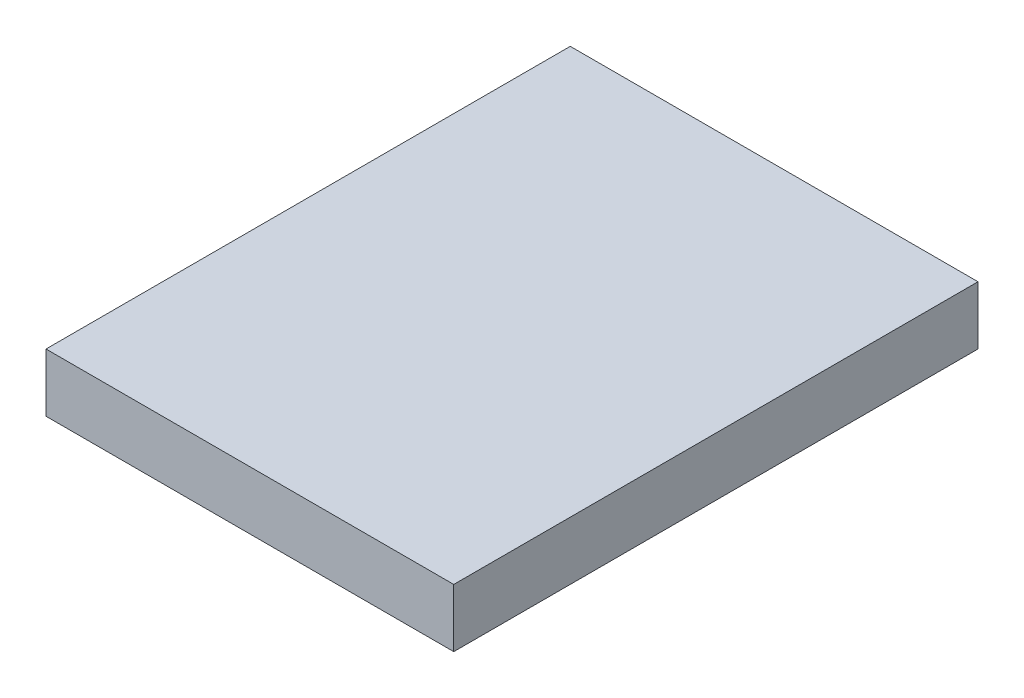
ISO-10303-21;
HEADER;
FILE_DESCRIPTION(('STEP AP214'),'2;1');
FILE_NAME('part.step','',(''),(''),'','','');
FILE_SCHEMA(('AUTOMOTIVE_DESIGN { 1 0 10303 214 1 1 1 1 }'));
ENDSEC;
DATA;
#1=APPLICATION_CONTEXT('core data for automotive mechanical design processes');
#2=APPLICATION_PROTOCOL_DEFINITION('international standard','automotive_design',2000,#1);
#3=PRODUCT_CONTEXT('',#1,'mechanical');
#4=PRODUCT('Part','Part','',(#3));
#5=PRODUCT_RELATED_PRODUCT_CATEGORY('part','',(#4));
#6=PRODUCT_DEFINITION_FORMATION('','',#4);
#7=PRODUCT_DEFINITION_CONTEXT('part definition',#1,'design');
#8=PRODUCT_DEFINITION('design','',#6,#7);
#9=PRODUCT_DEFINITION_SHAPE('','',#8);
#10=(LENGTH_UNIT() NAMED_UNIT(*) SI_UNIT(.MILLI.,.METRE.));
#11=(NAMED_UNIT(*) PLANE_ANGLE_UNIT() SI_UNIT($,.RADIAN.));
#12=(NAMED_UNIT(*) SI_UNIT($,.STERADIAN.) SOLID_ANGLE_UNIT());
#13=UNCERTAINTY_MEASURE_WITH_UNIT(LENGTH_MEASURE(1.E-05),#10,'distance_accuracy_value','');
#14=(GEOMETRIC_REPRESENTATION_CONTEXT(3) GLOBAL_UNCERTAINTY_ASSIGNED_CONTEXT((#13)) GLOBAL_UNIT_ASSIGNED_CONTEXT((#10,
#11,#12)) REPRESENTATION_CONTEXT('',''));
#15=CARTESIAN_POINT('',(0.,0.,0.));
#16=DIRECTION('',(0.,0.,1.));
#17=DIRECTION('',(1.,0.,0.));
#18=AXIS2_PLACEMENT_3D('',#15,#16,#17);
#19=CARTESIAN_POINT('',(88.9,-12.7,228.6));
#20=DIRECTION('',(-1.,0.,0.));
#21=DIRECTION('',(0.,0.,1.));
#22=AXIS2_PLACEMENT_3D('',#19,#20,#21);
#23=PLANE('',#22);
#24=DIRECTION('',(0.,1.,0.));
#25=VECTOR('',#24,1.);
#26=CARTESIAN_POINT('',(88.9,-12.7,0.));
#27=LINE('',#26,#25);
#28=CARTESIAN_POINT('',(88.9,-12.7,0.));
#29=VERTEX_POINT('',#28);
#30=CARTESIAN_POINT('',(88.9,12.7,0.));
#31=VERTEX_POINT('',#30);
#32=EDGE_CURVE('E104',#29,#31,#27,.T.);
#33=ORIENTED_EDGE('',*,*,#32,.T.);
#34=DIRECTION('',(0.,0.,-1.));
#35=VECTOR('',#34,1.);
#36=CARTESIAN_POINT('',(88.9,12.7,228.6));
#37=LINE('',#36,#35);
#38=CARTESIAN_POINT('',(88.9,12.7,228.6));
#39=VERTEX_POINT('',#38);
#40=EDGE_CURVE('E11',#39,#31,#37,.T.);
#41=ORIENTED_EDGE('',*,*,#40,.F.);
#42=DIRECTION('',(0.,1.,0.));
#43=VECTOR('',#42,1.);
#44=CARTESIAN_POINT('',(88.9,-12.7,228.6));
#45=LINE('',#44,#43);
#46=CARTESIAN_POINT('',(88.9,-12.7,228.6));
#47=VERTEX_POINT('',#46);
#48=EDGE_CURVE('E92',#47,#39,#45,.T.);
#49=ORIENTED_EDGE('',*,*,#48,.F.);
#50=DIRECTION('',(0.,0.,-1.));
#51=VECTOR('',#50,1.);
#52=CARTESIAN_POINT('',(88.9,-12.7,228.6));
#53=LINE('',#52,#51);
#54=EDGE_CURVE('E100',#47,#29,#53,.T.);
#55=ORIENTED_EDGE('',*,*,#54,.T.);
#56=EDGE_LOOP('',(#33,#41,#49,#55));
#57=FACE_BOUND('',#56,.T.);
#58=ADVANCED_FACE('F41',(#57),#23,.F.);
#59=CARTESIAN_POINT('',(-88.9,12.7,228.6));
#60=DIRECTION('',(0.,-1.,0.));
#61=DIRECTION('',(0.,0.,-1.));
#62=AXIS2_PLACEMENT_3D('',#59,#60,#61);
#63=PLANE('',#62);
#64=DIRECTION('',(-1.,0.,0.));
#65=VECTOR('',#64,1.);
#66=CARTESIAN_POINT('',(-88.9,12.7,0.));
#67=LINE('',#66,#65);
#68=CARTESIAN_POINT('',(-88.9,12.7,0.));
#69=VERTEX_POINT('',#68);
#70=EDGE_CURVE('E96',#31,#69,#67,.T.);
#71=ORIENTED_EDGE('',*,*,#70,.T.);
#72=DIRECTION('',(0.,0.,-1.));
#73=VECTOR('',#72,1.);
#74=CARTESIAN_POINT('',(-88.9,12.7,228.6));
#75=LINE('',#74,#73);
#76=CARTESIAN_POINT('',(-88.9,12.7,228.6));
#77=VERTEX_POINT('',#76);
#78=EDGE_CURVE('E49',#77,#69,#75,.T.);
#79=ORIENTED_EDGE('',*,*,#78,.F.);
#80=DIRECTION('',(-1.,0.,0.));
#81=VECTOR('',#80,1.);
#82=CARTESIAN_POINT('',(-88.9,12.7,228.6));
#83=LINE('',#82,#81);
#84=EDGE_CURVE('E87',#39,#77,#83,.T.);
#85=ORIENTED_EDGE('',*,*,#84,.F.);
#86=ORIENTED_EDGE('',*,*,#40,.T.);
#87=EDGE_LOOP('',(#71,#79,#85,#86));
#88=FACE_BOUND('',#87,.T.);
#89=ADVANCED_FACE('F95',(#88),#63,.F.);
#90=CARTESIAN_POINT('',(-88.9,-12.7,228.6));
#91=DIRECTION('',(1.,0.,0.));
#92=DIRECTION('',(0.,0.,-1.));
#93=AXIS2_PLACEMENT_3D('',#90,#91,#92);
#94=PLANE('',#93);
#95=DIRECTION('',(0.,-1.,0.));
#96=VECTOR('',#95,1.);
#97=CARTESIAN_POINT('',(-88.9,-12.7,0.));
#98=LINE('',#97,#96);
#99=CARTESIAN_POINT('',(-88.9,-12.7,0.));
#100=VERTEX_POINT('',#99);
#101=EDGE_CURVE('E74',#69,#100,#98,.T.);
#102=ORIENTED_EDGE('',*,*,#101,.T.);
#103=DIRECTION('',(0.,0.,-1.));
#104=VECTOR('',#103,1.);
#105=CARTESIAN_POINT('',(-88.9,-12.7,228.6));
#106=LINE('',#105,#104);
#107=CARTESIAN_POINT('',(-88.9,-12.7,228.6));
#108=VERTEX_POINT('',#107);
#109=EDGE_CURVE('E97',#108,#100,#106,.T.);
#110=ORIENTED_EDGE('',*,*,#109,.F.);
#111=DIRECTION('',(0.,-1.,0.));
#112=VECTOR('',#111,1.);
#113=CARTESIAN_POINT('',(-88.9,-12.7,228.6));
#114=LINE('',#113,#112);
#115=EDGE_CURVE('E90',#77,#108,#114,.T.);
#116=ORIENTED_EDGE('',*,*,#115,.F.);
#117=ORIENTED_EDGE('',*,*,#78,.T.);
#118=EDGE_LOOP('',(#102,#110,#116,#117));
#119=FACE_BOUND('',#118,.T.);
#120=ADVANCED_FACE('F98',(#119),#94,.F.);
#121=CARTESIAN_POINT('',(-88.9,-12.7,228.6));
#122=DIRECTION('',(0.,1.,0.));
#123=DIRECTION('',(0.,0.,1.));
#124=AXIS2_PLACEMENT_3D('',#121,#122,#123);
#125=PLANE('',#124);
#126=DIRECTION('',(1.,0.,0.));
#127=VECTOR('',#126,1.);
#128=CARTESIAN_POINT('',(-88.9,-12.7,0.));
#129=LINE('',#128,#127);
#130=EDGE_CURVE('E80',#100,#29,#129,.T.);
#131=ORIENTED_EDGE('',*,*,#130,.T.);
#132=ORIENTED_EDGE('',*,*,#54,.F.);
#133=DIRECTION('',(1.,0.,0.));
#134=VECTOR('',#133,1.);
#135=CARTESIAN_POINT('',(-88.9,-12.7,228.6));
#136=LINE('',#135,#134);
#137=EDGE_CURVE('E57',#108,#47,#136,.T.);
#138=ORIENTED_EDGE('',*,*,#137,.F.);
#139=ORIENTED_EDGE('',*,*,#109,.T.);
#140=EDGE_LOOP('',(#131,#132,#138,#139));
#141=FACE_BOUND('',#140,.T.);
#142=ADVANCED_FACE('F111',(#141),#125,.F.);
#143=CARTESIAN_POINT('',(0.,0.,228.6));
#144=DIRECTION('',(0.,0.,-1.));
#145=DIRECTION('',(-1.,0.,0.));
#146=AXIS2_PLACEMENT_3D('',#143,#144,#145);
#147=PLANE('',#146);
#148=ORIENTED_EDGE('',*,*,#48,.T.);
#149=ORIENTED_EDGE('',*,*,#84,.T.);
#150=ORIENTED_EDGE('',*,*,#115,.T.);
#151=ORIENTED_EDGE('',*,*,#137,.T.);
#152=EDGE_LOOP('',(#148,#149,#150,#151));
#153=FACE_BOUND('',#152,.T.);
#154=ADVANCED_FACE('F88',(#153),#147,.F.);
#155=CARTESIAN_POINT('',(0.,0.,0.));
#156=DIRECTION('',(0.,0.,-1.));
#157=DIRECTION('',(-1.,0.,0.));
#158=AXIS2_PLACEMENT_3D('',#155,#156,#157);
#159=PLANE('',#158);
#160=ORIENTED_EDGE('',*,*,#32,.F.);
#161=ORIENTED_EDGE('',*,*,#130,.F.);
#162=ORIENTED_EDGE('',*,*,#101,.F.);
#163=ORIENTED_EDGE('',*,*,#70,.F.);
#164=EDGE_LOOP('',(#160,#161,#162,#163));
#165=FACE_BOUND('',#164,.T.);
#166=ADVANCED_FACE('F114',(#165),#159,.T.);
#167=CLOSED_SHELL('',(#58,#89,#120,#142,#154,#166));
#168=MANIFOLD_SOLID_BREP('B2',#167);
#169=ADVANCED_BREP_SHAPE_REPRESENTATION('',(#18,#168),#14);
#170=SHAPE_DEFINITION_REPRESENTATION(#9,#169);
ENDSEC;
END-ISO-10303-21;
